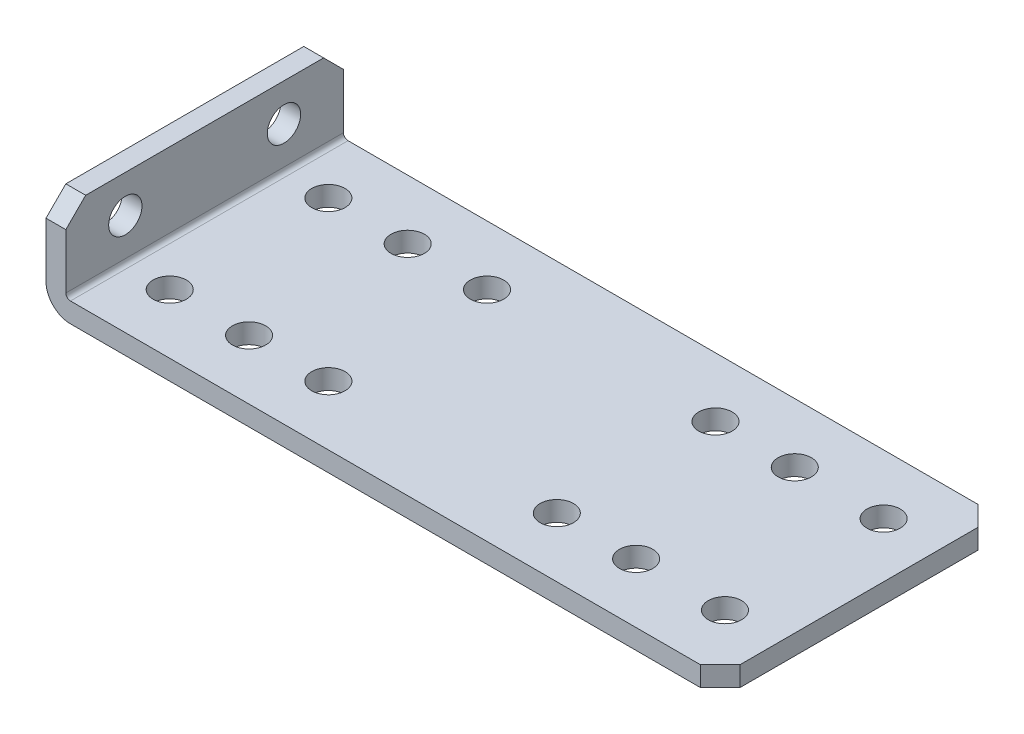
ISO-10303-21;
HEADER;
FILE_DESCRIPTION(('STEP AP214'),'2;1');
FILE_NAME('part.step','',(''),(''),'','','');
FILE_SCHEMA(('AUTOMOTIVE_DESIGN { 1 0 10303 214 1 1 1 1 }'));
ENDSEC;
DATA;
#1=APPLICATION_CONTEXT('core data for automotive mechanical design processes');
#2=APPLICATION_PROTOCOL_DEFINITION('international standard','automotive_design',2000,#1);
#3=PRODUCT_CONTEXT('',#1,'mechanical');
#4=PRODUCT('Part','Part','',(#3));
#5=PRODUCT_RELATED_PRODUCT_CATEGORY('part','',(#4));
#6=PRODUCT_DEFINITION_FORMATION('','',#4);
#7=PRODUCT_DEFINITION_CONTEXT('part definition',#1,'design');
#8=PRODUCT_DEFINITION('design','',#6,#7);
#9=PRODUCT_DEFINITION_SHAPE('','',#8);
#10=(LENGTH_UNIT() NAMED_UNIT(*) SI_UNIT(.MILLI.,.METRE.));
#11=(NAMED_UNIT(*) PLANE_ANGLE_UNIT() SI_UNIT($,.RADIAN.));
#12=(NAMED_UNIT(*) SI_UNIT($,.STERADIAN.) SOLID_ANGLE_UNIT());
#13=UNCERTAINTY_MEASURE_WITH_UNIT(LENGTH_MEASURE(1.E-05),#10,'distance_accuracy_value','');
#14=(GEOMETRIC_REPRESENTATION_CONTEXT(3) GLOBAL_UNCERTAINTY_ASSIGNED_CONTEXT((#13)) GLOBAL_UNIT_ASSIGNED_CONTEXT((#10,
#11,#12)) REPRESENTATION_CONTEXT('',''));
#15=CARTESIAN_POINT('',(0.,0.,0.));
#16=DIRECTION('',(0.,0.,1.));
#17=DIRECTION('',(1.,0.,0.));
#18=AXIS2_PLACEMENT_3D('',#15,#16,#17);
#19=CARTESIAN_POINT('',(0.,0.,44.45));
#20=DIRECTION('',(-1.,0.,0.));
#21=DIRECTION('',(0.,0.,1.));
#22=AXIS2_PLACEMENT_3D('',#19,#20,#21);
#23=PLANE('',#22);
#24=DIRECTION('',(0.,1.,0.));
#25=VECTOR('',#24,1.);
#26=CARTESIAN_POINT('',(0.,3.9116,0.));
#27=LINE('',#26,#25);
#28=CARTESIAN_POINT('',(0.,12.7,0.));
#29=VERTEX_POINT('',#28);
#30=CARTESIAN_POINT('',(0.,3.9116,0.));
#31=VERTEX_POINT('',#30);
#32=EDGE_CURVE('E120',#29,#31,#27,.F.);
#33=ORIENTED_EDGE('',*,*,#32,.T.);
#34=DIRECTION('',(0.,0.,-1.));
#35=VECTOR('',#34,1.);
#36=CARTESIAN_POINT('',(0.,3.9116,44.45));
#37=LINE('',#36,#35);
#38=CARTESIAN_POINT('',(0.,3.9116,44.45));
#39=VERTEX_POINT('',#38);
#40=EDGE_CURVE('E117',#39,#31,#37,.T.);
#41=ORIENTED_EDGE('',*,*,#40,.F.);
#42=DIRECTION('',(0.,1.,0.));
#43=VECTOR('',#42,1.);
#44=CARTESIAN_POINT('',(0.,3.175,44.45));
#45=LINE('',#44,#43);
#46=CARTESIAN_POINT('',(0.,12.7,44.45));
#47=VERTEX_POINT('',#46);
#48=EDGE_CURVE('E102',#47,#39,#45,.F.);
#49=ORIENTED_EDGE('',*,*,#48,.F.);
#50=DIRECTION('',(0.,0.707106781186549,-0.707106781186546));
#51=VECTOR('',#50,1.);
#52=CARTESIAN_POINT('',(0.,15.875,41.275));
#53=LINE('',#52,#51);
#54=CARTESIAN_POINT('',(0.,15.875,41.275));
#55=VERTEX_POINT('',#54);
#56=EDGE_CURVE('E293',#47,#55,#53,.T.);
#57=ORIENTED_EDGE('',*,*,#56,.T.);
#58=DIRECTION('',(0.,0.,1.));
#59=VECTOR('',#58,1.);
#60=CARTESIAN_POINT('',(0.,15.875,44.45));
#61=LINE('',#60,#59);
#62=CARTESIAN_POINT('',(0.,15.875,3.17500000000002));
#63=VERTEX_POINT('',#62);
#64=EDGE_CURVE('E291',#63,#55,#61,.T.);
#65=ORIENTED_EDGE('',*,*,#64,.F.);
#66=DIRECTION('',(0.,0.707106781186546,0.707106781186549));
#67=VECTOR('',#66,1.);
#68=CARTESIAN_POINT('',(0.,12.7,0.));
#69=LINE('',#68,#67);
#70=EDGE_CURVE('E114',#29,#63,#69,.T.);
#71=ORIENTED_EDGE('',*,*,#70,.F.);
#72=EDGE_LOOP('',(#33,#41,#49,#57,#65,#71));
#73=FACE_BOUND('',#72,.T.);
#74=CARTESIAN_POINT('',(0.,9.89330000000001,34.925));
#75=DIRECTION('',(-1.,0.,0.));
#76=DIRECTION('',(0.,0.,1.));
#77=AXIS2_PLACEMENT_3D('',#74,#75,#76);
#78=CIRCLE('',#77,2.667);
#79=CARTESIAN_POINT('',(0.,9.89330000000001,37.592));
#80=VERTEX_POINT('',#79);
#81=EDGE_CURVE('E133',#80,#80,#78,.F.);
#82=ORIENTED_EDGE('',*,*,#81,.T.);
#83=EDGE_LOOP('',(#82));
#84=FACE_BOUND('',#83,.T.);
#85=CARTESIAN_POINT('',(0.,9.8933,9.525));
#86=DIRECTION('',(-1.,0.,0.));
#87=DIRECTION('',(0.,0.,1.));
#88=AXIS2_PLACEMENT_3D('',#85,#86,#87);
#89=CIRCLE('',#88,2.667);
#90=CARTESIAN_POINT('',(0.,9.8933,12.192));
#91=VERTEX_POINT('',#90);
#92=EDGE_CURVE('E20',#91,#91,#89,.F.);
#93=ORIENTED_EDGE('',*,*,#92,.T.);
#94=EDGE_LOOP('',(#93));
#95=FACE_BOUND('',#94,.T.);
#96=ADVANCED_FACE('F17',(#73,#84,#95),#23,.T.);
#97=CARTESIAN_POINT('',(107.95,9.8933,9.525));
#98=DIRECTION('',(-1.,0.,0.));
#99=DIRECTION('',(0.,0.,1.));
#100=AXIS2_PLACEMENT_3D('',#97,#98,#99);
#101=CYLINDRICAL_SURFACE('',#100,2.667);
#102=CARTESIAN_POINT('',(3.175,9.8933,9.525));
#103=DIRECTION('',(-1.,0.,0.));
#104=DIRECTION('',(0.,0.,1.));
#105=AXIS2_PLACEMENT_3D('',#102,#103,#104);
#106=CIRCLE('',#105,2.667);
#107=CARTESIAN_POINT('',(3.175,9.8933,12.192));
#108=VERTEX_POINT('',#107);
#109=EDGE_CURVE('E130',#108,#108,#106,.F.);
#110=ORIENTED_EDGE('',*,*,#109,.T.);
#111=EDGE_LOOP('',(#110));
#112=FACE_BOUND('',#111,.T.);
#113=ORIENTED_EDGE('',*,*,#92,.F.);
#114=EDGE_LOOP('',(#113));
#115=FACE_BOUND('',#114,.T.);
#116=ADVANCED_FACE('F141',(#112,#115),#101,.F.);
#117=CARTESIAN_POINT('',(107.95,9.89330000000001,34.925));
#118=DIRECTION('',(-1.,0.,0.));
#119=DIRECTION('',(0.,0.,1.));
#120=AXIS2_PLACEMENT_3D('',#117,#118,#119);
#121=CYLINDRICAL_SURFACE('',#120,2.667);
#122=CARTESIAN_POINT('',(3.175,9.89330000000001,34.925));
#123=DIRECTION('',(-1.,0.,0.));
#124=DIRECTION('',(0.,0.,1.));
#125=AXIS2_PLACEMENT_3D('',#122,#123,#124);
#126=CIRCLE('',#125,2.667);
#127=CARTESIAN_POINT('',(3.175,9.89330000000001,37.592));
#128=VERTEX_POINT('',#127);
#129=EDGE_CURVE('E265',#128,#128,#126,.F.);
#130=ORIENTED_EDGE('',*,*,#129,.T.);
#131=EDGE_LOOP('',(#130));
#132=FACE_BOUND('',#131,.T.);
#133=ORIENTED_EDGE('',*,*,#81,.F.);
#134=EDGE_LOOP('',(#133));
#135=FACE_BOUND('',#134,.T.);
#136=ADVANCED_FACE('F143',(#132,#135),#121,.F.);
#137=CARTESIAN_POINT('',(3.9116,12.7,0.));
#138=DIRECTION('',(0.,0.707106781186549,-0.707106781186546));
#139=DIRECTION('',(0.,0.707106781186546,0.707106781186549));
#140=AXIS2_PLACEMENT_3D('',#137,#138,#139);
#141=PLANE('',#140);
#142=DIRECTION('',(0.,-0.707106781186546,-0.707106781186549));
#143=VECTOR('',#142,1.);
#144=CARTESIAN_POINT('',(3.175,15.875,3.17500000000001));
#145=LINE('',#144,#143);
#146=CARTESIAN_POINT('',(3.175,15.875,3.17500000000001));
#147=VERTEX_POINT('',#146);
#148=CARTESIAN_POINT('',(3.175,12.7,0.));
#149=VERTEX_POINT('',#148);
#150=EDGE_CURVE('E257',#147,#149,#145,.T.);
#151=ORIENTED_EDGE('',*,*,#150,.T.);
#152=DIRECTION('',(1.,0.,0.));
#153=VECTOR('',#152,1.);
#154=CARTESIAN_POINT('',(3.9116,12.7,0.));
#155=LINE('',#154,#153);
#156=EDGE_CURVE('E258',#149,#29,#155,.F.);
#157=ORIENTED_EDGE('',*,*,#156,.T.);
#158=ORIENTED_EDGE('',*,*,#70,.T.);
#159=DIRECTION('',(1.,0.,0.));
#160=VECTOR('',#159,1.);
#161=CARTESIAN_POINT('',(0.,15.875,3.17500000000001));
#162=LINE('',#161,#160);
#163=EDGE_CURVE('E260',#147,#63,#162,.F.);
#164=ORIENTED_EDGE('',*,*,#163,.F.);
#165=EDGE_LOOP('',(#151,#157,#158,#164));
#166=FACE_BOUND('',#165,.T.);
#167=ADVANCED_FACE('F150',(#166),#141,.T.);
#168=CARTESIAN_POINT('',(0.,15.875,41.275));
#169=DIRECTION('',(0.,-0.707106781186546,-0.707106781186549));
#170=DIRECTION('',(0.,0.707106781186549,-0.707106781186546));
#171=AXIS2_PLACEMENT_3D('',#168,#169,#170);
#172=PLANE('',#171);
#173=DIRECTION('',(1.,0.,0.));
#174=VECTOR('',#173,1.);
#175=CARTESIAN_POINT('',(0.,12.7,44.45));
#176=LINE('',#175,#174);
#177=CARTESIAN_POINT('',(3.175,12.7,44.45));
#178=VERTEX_POINT('',#177);
#179=EDGE_CURVE('E110',#178,#47,#176,.F.);
#180=ORIENTED_EDGE('',*,*,#179,.F.);
#181=DIRECTION('',(0.,0.707106781186549,-0.707106781186546));
#182=VECTOR('',#181,1.);
#183=CARTESIAN_POINT('',(3.175,12.7,44.45));
#184=LINE('',#183,#182);
#185=CARTESIAN_POINT('',(3.175,15.875,41.275));
#186=VERTEX_POINT('',#185);
#187=EDGE_CURVE('E284',#178,#186,#184,.T.);
#188=ORIENTED_EDGE('',*,*,#187,.T.);
#189=DIRECTION('',(1.,0.,0.));
#190=VECTOR('',#189,1.);
#191=CARTESIAN_POINT('',(0.,15.875,41.275));
#192=LINE('',#191,#190);
#193=EDGE_CURVE('E278',#55,#186,#192,.T.);
#194=ORIENTED_EDGE('',*,*,#193,.F.);
#195=ORIENTED_EDGE('',*,*,#56,.F.);
#196=EDGE_LOOP('',(#180,#188,#194,#195));
#197=FACE_BOUND('',#196,.T.);
#198=ADVANCED_FACE('F245',(#197),#172,.F.);
#199=CARTESIAN_POINT('',(0.,15.875,44.45));
#200=DIRECTION('',(0.,1.,0.));
#201=DIRECTION('',(0.,0.,1.));
#202=AXIS2_PLACEMENT_3D('',#199,#200,#201);
#203=PLANE('',#202);
#204=DIRECTION('',(0.,0.,1.));
#205=VECTOR('',#204,1.);
#206=CARTESIAN_POINT('',(3.175,15.875,44.45));
#207=LINE('',#206,#205);
#208=EDGE_CURVE('E281',#186,#147,#207,.F.);
#209=ORIENTED_EDGE('',*,*,#208,.T.);
#210=ORIENTED_EDGE('',*,*,#163,.T.);
#211=ORIENTED_EDGE('',*,*,#64,.T.);
#212=ORIENTED_EDGE('',*,*,#193,.T.);
#213=EDGE_LOOP('',(#209,#210,#211,#212));
#214=FACE_BOUND('',#213,.T.);
#215=ADVANCED_FACE('F242',(#214),#203,.T.);
#216=CARTESIAN_POINT('',(3.9116,3.9116,44.45));
#217=DIRECTION('',(0.,0.,-1.));
#218=DIRECTION('',(-1.,0.,0.));
#219=AXIS2_PLACEMENT_3D('',#216,#217,#218);
#220=CYLINDRICAL_SURFACE('',#219,3.9116);
#221=CARTESIAN_POINT('',(3.9116,3.9116,44.45));
#222=DIRECTION('',(0.,0.,-1.));
#223=DIRECTION('',(-1.,0.,0.));
#224=AXIS2_PLACEMENT_3D('',#221,#222,#223);
#225=CIRCLE('',#224,3.9116);
#226=CARTESIAN_POINT('',(3.9116,0.,44.45));
#227=VERTEX_POINT('',#226);
#228=EDGE_CURVE('E107',#39,#227,#225,.F.);
#229=ORIENTED_EDGE('',*,*,#228,.F.);
#230=ORIENTED_EDGE('',*,*,#40,.T.);
#231=CARTESIAN_POINT('',(3.9116,3.9116,0.));
#232=DIRECTION('',(0.,0.,-1.));
#233=DIRECTION('',(-1.,0.,0.));
#234=AXIS2_PLACEMENT_3D('',#231,#232,#233);
#235=CIRCLE('',#234,3.9116);
#236=CARTESIAN_POINT('',(3.9116,0.,0.));
#237=VERTEX_POINT('',#236);
#238=EDGE_CURVE('E283',#237,#31,#235,.T.);
#239=ORIENTED_EDGE('',*,*,#238,.F.);
#240=DIRECTION('',(0.,0.,-1.));
#241=VECTOR('',#240,1.);
#242=CARTESIAN_POINT('',(3.9116,0.,44.45));
#243=LINE('',#242,#241);
#244=EDGE_CURVE('E126',#227,#237,#243,.T.);
#245=ORIENTED_EDGE('',*,*,#244,.F.);
#246=EDGE_LOOP('',(#229,#230,#239,#245));
#247=FACE_BOUND('',#246,.T.);
#248=ADVANCED_FACE('F125',(#247),#220,.T.);
#249=CARTESIAN_POINT('',(3.175,0.,44.45));
#250=DIRECTION('',(-1.,0.,0.));
#251=DIRECTION('',(0.,0.,1.));
#252=AXIS2_PLACEMENT_3D('',#249,#250,#251);
#253=PLANE('',#252);
#254=ORIENTED_EDGE('',*,*,#187,.F.);
#255=DIRECTION('',(0.,1.,0.));
#256=VECTOR('',#255,1.);
#257=CARTESIAN_POINT('',(3.175,0.,44.45));
#258=LINE('',#257,#256);
#259=CARTESIAN_POINT('',(3.175,3.9116,44.45));
#260=VERTEX_POINT('',#259);
#261=EDGE_CURVE('E267',#260,#178,#258,.T.);
#262=ORIENTED_EDGE('',*,*,#261,.F.);
#263=DIRECTION('',(0.,0.,-1.));
#264=VECTOR('',#263,1.);
#265=CARTESIAN_POINT('',(3.175,3.9116,44.45));
#266=LINE('',#265,#264);
#267=CARTESIAN_POINT('',(3.175,3.9116,0.));
#268=VERTEX_POINT('',#267);
#269=EDGE_CURVE('E343',#260,#268,#266,.T.);
#270=ORIENTED_EDGE('',*,*,#269,.T.);
#271=DIRECTION('',(0.,1.,0.));
#272=VECTOR('',#271,1.);
#273=CARTESIAN_POINT('',(3.175,0.,0.));
#274=LINE('',#273,#272);
#275=EDGE_CURVE('E264',#149,#268,#274,.F.);
#276=ORIENTED_EDGE('',*,*,#275,.F.);
#277=ORIENTED_EDGE('',*,*,#150,.F.);
#278=ORIENTED_EDGE('',*,*,#208,.F.);
#279=EDGE_LOOP('',(#254,#262,#270,#276,#277,#278));
#280=FACE_BOUND('',#279,.T.);
#281=ORIENTED_EDGE('',*,*,#129,.F.);
#282=EDGE_LOOP('',(#281));
#283=FACE_BOUND('',#282,.T.);
#284=ORIENTED_EDGE('',*,*,#109,.F.);
#285=EDGE_LOOP('',(#284));
#286=FACE_BOUND('',#285,.T.);
#287=ADVANCED_FACE('F235',(#280,#283,#286),#253,.F.);
#288=CARTESIAN_POINT('',(0.,0.,44.45));
#289=DIRECTION('',(0.,-1.,0.));
#290=DIRECTION('',(0.,0.,-1.));
#291=AXIS2_PLACEMENT_3D('',#288,#289,#290);
#292=PLANE('',#291);
#293=DIRECTION('',(1.,0.,0.));
#294=VECTOR('',#293,1.);
#295=CARTESIAN_POINT('',(3.9116,0.,44.45));
#296=LINE('',#295,#294);
#297=CARTESIAN_POINT('',(104.775,0.,44.45));
#298=VERTEX_POINT('',#297);
#299=EDGE_CURVE('E410',#227,#298,#296,.T.);
#300=ORIENTED_EDGE('',*,*,#299,.F.);
#301=ORIENTED_EDGE('',*,*,#244,.T.);
#302=DIRECTION('',(-1.,0.,0.));
#303=VECTOR('',#302,1.);
#304=CARTESIAN_POINT('',(3.175,0.,0.));
#305=LINE('',#304,#303);
#306=CARTESIAN_POINT('',(104.775,0.,0.));
#307=VERTEX_POINT('',#306);
#308=EDGE_CURVE('E342',#307,#237,#305,.T.);
#309=ORIENTED_EDGE('',*,*,#308,.F.);
#310=DIRECTION('',(0.707106781186546,0.,0.707106781186549));
#311=VECTOR('',#310,1.);
#312=CARTESIAN_POINT('',(104.775,0.,0.));
#313=LINE('',#312,#311);
#314=CARTESIAN_POINT('',(107.95,0.,3.17500000000001));
#315=VERTEX_POINT('',#314);
#316=EDGE_CURVE('E389',#307,#315,#313,.T.);
#317=ORIENTED_EDGE('',*,*,#316,.T.);
#318=DIRECTION('',(0.,0.,-1.));
#319=VECTOR('',#318,1.);
#320=CARTESIAN_POINT('',(107.95,0.,44.45));
#321=LINE('',#320,#319);
#322=CARTESIAN_POINT('',(107.95,0.,41.275));
#323=VERTEX_POINT('',#322);
#324=EDGE_CURVE('E392',#323,#315,#321,.T.);
#325=ORIENTED_EDGE('',*,*,#324,.F.);
#326=DIRECTION('',(-0.707106781186549,0.,0.707106781186546));
#327=VECTOR('',#326,1.);
#328=CARTESIAN_POINT('',(107.95,0.,41.275));
#329=LINE('',#328,#327);
#330=EDGE_CURVE('E347',#323,#298,#329,.T.);
#331=ORIENTED_EDGE('',*,*,#330,.T.);
#332=EDGE_LOOP('',(#300,#301,#309,#317,#325,#331));
#333=FACE_BOUND('',#332,.T.);
#334=CARTESIAN_POINT('',(99.187,0.,9.52499999999999));
#335=DIRECTION('',(0.,1.,0.));
#336=DIRECTION('',(0.,0.,1.));
#337=AXIS2_PLACEMENT_3D('',#334,#335,#336);
#338=CIRCLE('',#337,2.667);
#339=CARTESIAN_POINT('',(99.187,0.,12.192));
#340=VERTEX_POINT('',#339);
#341=EDGE_CURVE('E344',#340,#340,#338,.T.);
#342=ORIENTED_EDGE('',*,*,#341,.T.);
#343=EDGE_LOOP('',(#342));
#344=FACE_BOUND('',#343,.T.);
#345=CARTESIAN_POINT('',(99.187,0.,34.925));
#346=DIRECTION('',(0.,1.,0.));
#347=DIRECTION('',(0.,0.,1.));
#348=AXIS2_PLACEMENT_3D('',#345,#346,#347);
#349=CIRCLE('',#348,2.667);
#350=CARTESIAN_POINT('',(99.187,0.,37.592));
#351=VERTEX_POINT('',#350);
#352=EDGE_CURVE('E348',#351,#351,#349,.T.);
#353=ORIENTED_EDGE('',*,*,#352,.T.);
#354=EDGE_LOOP('',(#353));
#355=FACE_BOUND('',#354,.T.);
#356=CARTESIAN_POINT('',(22.987,0.,9.525));
#357=DIRECTION('',(0.,1.,0.));
#358=DIRECTION('',(0.,0.,1.));
#359=AXIS2_PLACEMENT_3D('',#356,#357,#358);
#360=CIRCLE('',#359,2.667);
#361=CARTESIAN_POINT('',(22.987,0.,12.192));
#362=VERTEX_POINT('',#361);
#363=EDGE_CURVE('E351',#362,#362,#360,.T.);
#364=ORIENTED_EDGE('',*,*,#363,.T.);
#365=EDGE_LOOP('',(#364));
#366=FACE_BOUND('',#365,.T.);
#367=CARTESIAN_POINT('',(10.287,0.,9.525));
#368=DIRECTION('',(0.,1.,0.));
#369=DIRECTION('',(0.,0.,1.));
#370=AXIS2_PLACEMENT_3D('',#367,#368,#369);
#371=CIRCLE('',#370,2.667);
#372=CARTESIAN_POINT('',(10.287,0.,12.192));
#373=VERTEX_POINT('',#372);
#374=EDGE_CURVE('E354',#373,#373,#371,.T.);
#375=ORIENTED_EDGE('',*,*,#374,.T.);
#376=EDGE_LOOP('',(#375));
#377=FACE_BOUND('',#376,.T.);
#378=CARTESIAN_POINT('',(10.287,0.,34.925));
#379=DIRECTION('',(0.,1.,0.));
#380=DIRECTION('',(0.,0.,1.));
#381=AXIS2_PLACEMENT_3D('',#378,#379,#380);
#382=CIRCLE('',#381,2.667);
#383=CARTESIAN_POINT('',(10.287,0.,37.592));
#384=VERTEX_POINT('',#383);
#385=EDGE_CURVE('E357',#384,#384,#382,.T.);
#386=ORIENTED_EDGE('',*,*,#385,.T.);
#387=EDGE_LOOP('',(#386));
#388=FACE_BOUND('',#387,.T.);
#389=CARTESIAN_POINT('',(35.687,0.,9.52499999999999));
#390=DIRECTION('',(0.,1.,0.));
#391=DIRECTION('',(0.,0.,1.));
#392=AXIS2_PLACEMENT_3D('',#389,#390,#391);
#393=CIRCLE('',#392,2.667);
#394=CARTESIAN_POINT('',(35.687,0.,12.192));
#395=VERTEX_POINT('',#394);
#396=EDGE_CURVE('E360',#395,#395,#393,.T.);
#397=ORIENTED_EDGE('',*,*,#396,.T.);
#398=EDGE_LOOP('',(#397));
#399=FACE_BOUND('',#398,.T.);
#400=CARTESIAN_POINT('',(35.687,0.,34.925));
#401=DIRECTION('',(0.,1.,0.));
#402=DIRECTION('',(0.,0.,1.));
#403=AXIS2_PLACEMENT_3D('',#400,#401,#402);
#404=CIRCLE('',#403,2.667);
#405=CARTESIAN_POINT('',(35.687,0.,37.592));
#406=VERTEX_POINT('',#405);
#407=EDGE_CURVE('E363',#406,#406,#404,.T.);
#408=ORIENTED_EDGE('',*,*,#407,.T.);
#409=EDGE_LOOP('',(#408));
#410=FACE_BOUND('',#409,.T.);
#411=CARTESIAN_POINT('',(22.987,0.,34.925));
#412=DIRECTION('',(0.,1.,0.));
#413=DIRECTION('',(0.,0.,1.));
#414=AXIS2_PLACEMENT_3D('',#411,#412,#413);
#415=CIRCLE('',#414,2.667);
#416=CARTESIAN_POINT('',(22.987,0.,37.592));
#417=VERTEX_POINT('',#416);
#418=EDGE_CURVE('E366',#417,#417,#415,.T.);
#419=ORIENTED_EDGE('',*,*,#418,.T.);
#420=EDGE_LOOP('',(#419));
#421=FACE_BOUND('',#420,.T.);
#422=CARTESIAN_POINT('',(72.263,0.,9.52499999999999));
#423=DIRECTION('',(0.,1.,0.));
#424=DIRECTION('',(0.,0.,1.));
#425=AXIS2_PLACEMENT_3D('',#422,#423,#424);
#426=CIRCLE('',#425,2.667);
#427=CARTESIAN_POINT('',(72.263,0.,12.192));
#428=VERTEX_POINT('',#427);
#429=EDGE_CURVE('E369',#428,#428,#426,.T.);
#430=ORIENTED_EDGE('',*,*,#429,.T.);
#431=EDGE_LOOP('',(#430));
#432=FACE_BOUND('',#431,.T.);
#433=CARTESIAN_POINT('',(72.263,0.,34.925));
#434=DIRECTION('',(0.,1.,0.));
#435=DIRECTION('',(0.,0.,1.));
#436=AXIS2_PLACEMENT_3D('',#433,#434,#435);
#437=CIRCLE('',#436,2.667);
#438=CARTESIAN_POINT('',(72.263,0.,37.592));
#439=VERTEX_POINT('',#438);
#440=EDGE_CURVE('E372',#439,#439,#437,.T.);
#441=ORIENTED_EDGE('',*,*,#440,.T.);
#442=EDGE_LOOP('',(#441));
#443=FACE_BOUND('',#442,.T.);
#444=CARTESIAN_POINT('',(84.963,0.,34.925));
#445=DIRECTION('',(0.,1.,0.));
#446=DIRECTION('',(0.,0.,1.));
#447=AXIS2_PLACEMENT_3D('',#444,#445,#446);
#448=CIRCLE('',#447,2.66700000000001);
#449=CARTESIAN_POINT('',(84.963,0.,37.592));
#450=VERTEX_POINT('',#449);
#451=EDGE_CURVE('E375',#450,#450,#448,.T.);
#452=ORIENTED_EDGE('',*,*,#451,.T.);
#453=EDGE_LOOP('',(#452));
#454=FACE_BOUND('',#453,.T.);
#455=CARTESIAN_POINT('',(84.963,0.,9.525));
#456=DIRECTION('',(0.,1.,0.));
#457=DIRECTION('',(0.,0.,1.));
#458=AXIS2_PLACEMENT_3D('',#455,#456,#457);
#459=CIRCLE('',#458,2.66700000000001);
#460=CARTESIAN_POINT('',(84.963,0.,12.192));
#461=VERTEX_POINT('',#460);
#462=EDGE_CURVE('E378',#461,#461,#459,.T.);
#463=ORIENTED_EDGE('',*,*,#462,.T.);
#464=EDGE_LOOP('',(#463));
#465=FACE_BOUND('',#464,.T.);
#466=ADVANCED_FACE('F231',(#333,#344,#355,#366,#377,#388,#399,#410,#421,#432,#443,#454,#465),
#292,.T.);
#467=CARTESIAN_POINT('',(84.963,0.,9.525));
#468=DIRECTION('',(0.,1.,0.));
#469=DIRECTION('',(0.,0.,1.));
#470=AXIS2_PLACEMENT_3D('',#467,#468,#469);
#471=CYLINDRICAL_SURFACE('',#470,2.66700000000001);
#472=ORIENTED_EDGE('',*,*,#462,.F.);
#473=EDGE_LOOP('',(#472));
#474=FACE_BOUND('',#473,.T.);
#475=CARTESIAN_POINT('',(84.963,3.175,9.525));
#476=DIRECTION('',(0.,1.,0.));
#477=DIRECTION('',(0.,0.,1.));
#478=AXIS2_PLACEMENT_3D('',#475,#476,#477);
#479=CIRCLE('',#478,2.66700000000001);
#480=CARTESIAN_POINT('',(84.963,3.175,12.192));
#481=VERTEX_POINT('',#480);
#482=EDGE_CURVE('E336',#481,#481,#479,.T.);
#483=ORIENTED_EDGE('',*,*,#482,.T.);
#484=EDGE_LOOP('',(#483));
#485=FACE_BOUND('',#484,.T.);
#486=ADVANCED_FACE('F227',(#474,#485),#471,.F.);
#487=CARTESIAN_POINT('',(84.963,0.,34.925));
#488=DIRECTION('',(0.,1.,0.));
#489=DIRECTION('',(0.,0.,1.));
#490=AXIS2_PLACEMENT_3D('',#487,#488,#489);
#491=CYLINDRICAL_SURFACE('',#490,2.66700000000001);
#492=ORIENTED_EDGE('',*,*,#451,.F.);
#493=EDGE_LOOP('',(#492));
#494=FACE_BOUND('',#493,.T.);
#495=CARTESIAN_POINT('',(84.963,3.175,34.925));
#496=DIRECTION('',(0.,1.,0.));
#497=DIRECTION('',(0.,0.,1.));
#498=AXIS2_PLACEMENT_3D('',#495,#496,#497);
#499=CIRCLE('',#498,2.66700000000001);
#500=CARTESIAN_POINT('',(84.963,3.175,37.592));
#501=VERTEX_POINT('',#500);
#502=EDGE_CURVE('E333',#501,#501,#499,.T.);
#503=ORIENTED_EDGE('',*,*,#502,.T.);
#504=EDGE_LOOP('',(#503));
#505=FACE_BOUND('',#504,.T.);
#506=ADVANCED_FACE('F223',(#494,#505),#491,.F.);
#507=CARTESIAN_POINT('',(72.263,0.,34.925));
#508=DIRECTION('',(0.,1.,0.));
#509=DIRECTION('',(0.,0.,1.));
#510=AXIS2_PLACEMENT_3D('',#507,#508,#509);
#511=CYLINDRICAL_SURFACE('',#510,2.667);
#512=ORIENTED_EDGE('',*,*,#440,.F.);
#513=EDGE_LOOP('',(#512));
#514=FACE_BOUND('',#513,.T.);
#515=CARTESIAN_POINT('',(72.263,3.175,34.925));
#516=DIRECTION('',(0.,1.,0.));
#517=DIRECTION('',(0.,0.,1.));
#518=AXIS2_PLACEMENT_3D('',#515,#516,#517);
#519=CIRCLE('',#518,2.667);
#520=CARTESIAN_POINT('',(72.263,3.175,37.592));
#521=VERTEX_POINT('',#520);
#522=EDGE_CURVE('E330',#521,#521,#519,.T.);
#523=ORIENTED_EDGE('',*,*,#522,.T.);
#524=EDGE_LOOP('',(#523));
#525=FACE_BOUND('',#524,.T.);
#526=ADVANCED_FACE('F219',(#514,#525),#511,.F.);
#527=CARTESIAN_POINT('',(72.263,0.,9.52499999999999));
#528=DIRECTION('',(0.,1.,0.));
#529=DIRECTION('',(0.,0.,1.));
#530=AXIS2_PLACEMENT_3D('',#527,#528,#529);
#531=CYLINDRICAL_SURFACE('',#530,2.667);
#532=ORIENTED_EDGE('',*,*,#429,.F.);
#533=EDGE_LOOP('',(#532));
#534=FACE_BOUND('',#533,.T.);
#535=CARTESIAN_POINT('',(72.263,3.175,9.52499999999999));
#536=DIRECTION('',(0.,1.,0.));
#537=DIRECTION('',(0.,0.,1.));
#538=AXIS2_PLACEMENT_3D('',#535,#536,#537);
#539=CIRCLE('',#538,2.667);
#540=CARTESIAN_POINT('',(72.263,3.175,12.192));
#541=VERTEX_POINT('',#540);
#542=EDGE_CURVE('E327',#541,#541,#539,.T.);
#543=ORIENTED_EDGE('',*,*,#542,.T.);
#544=EDGE_LOOP('',(#543));
#545=FACE_BOUND('',#544,.T.);
#546=ADVANCED_FACE('F215',(#534,#545),#531,.F.);
#547=CARTESIAN_POINT('',(22.987,0.,34.925));
#548=DIRECTION('',(0.,1.,0.));
#549=DIRECTION('',(0.,0.,1.));
#550=AXIS2_PLACEMENT_3D('',#547,#548,#549);
#551=CYLINDRICAL_SURFACE('',#550,2.667);
#552=ORIENTED_EDGE('',*,*,#418,.F.);
#553=EDGE_LOOP('',(#552));
#554=FACE_BOUND('',#553,.T.);
#555=CARTESIAN_POINT('',(22.987,3.175,34.925));
#556=DIRECTION('',(0.,1.,0.));
#557=DIRECTION('',(0.,0.,1.));
#558=AXIS2_PLACEMENT_3D('',#555,#556,#557);
#559=CIRCLE('',#558,2.667);
#560=CARTESIAN_POINT('',(22.987,3.175,37.592));
#561=VERTEX_POINT('',#560);
#562=EDGE_CURVE('E324',#561,#561,#559,.T.);
#563=ORIENTED_EDGE('',*,*,#562,.T.);
#564=EDGE_LOOP('',(#563));
#565=FACE_BOUND('',#564,.T.);
#566=ADVANCED_FACE('F211',(#554,#565),#551,.F.);
#567=CARTESIAN_POINT('',(35.687,0.,34.925));
#568=DIRECTION('',(0.,1.,0.));
#569=DIRECTION('',(0.,0.,1.));
#570=AXIS2_PLACEMENT_3D('',#567,#568,#569);
#571=CYLINDRICAL_SURFACE('',#570,2.667);
#572=ORIENTED_EDGE('',*,*,#407,.F.);
#573=EDGE_LOOP('',(#572));
#574=FACE_BOUND('',#573,.T.);
#575=CARTESIAN_POINT('',(35.687,3.175,34.925));
#576=DIRECTION('',(0.,1.,0.));
#577=DIRECTION('',(0.,0.,1.));
#578=AXIS2_PLACEMENT_3D('',#575,#576,#577);
#579=CIRCLE('',#578,2.667);
#580=CARTESIAN_POINT('',(35.687,3.175,37.592));
#581=VERTEX_POINT('',#580);
#582=EDGE_CURVE('E321',#581,#581,#579,.T.);
#583=ORIENTED_EDGE('',*,*,#582,.T.);
#584=EDGE_LOOP('',(#583));
#585=FACE_BOUND('',#584,.T.);
#586=ADVANCED_FACE('F207',(#574,#585),#571,.F.);
#587=CARTESIAN_POINT('',(35.687,0.,9.52499999999999));
#588=DIRECTION('',(0.,1.,0.));
#589=DIRECTION('',(0.,0.,1.));
#590=AXIS2_PLACEMENT_3D('',#587,#588,#589);
#591=CYLINDRICAL_SURFACE('',#590,2.667);
#592=ORIENTED_EDGE('',*,*,#396,.F.);
#593=EDGE_LOOP('',(#592));
#594=FACE_BOUND('',#593,.T.);
#595=CARTESIAN_POINT('',(35.687,3.175,9.52499999999999));
#596=DIRECTION('',(0.,1.,0.));
#597=DIRECTION('',(0.,0.,1.));
#598=AXIS2_PLACEMENT_3D('',#595,#596,#597);
#599=CIRCLE('',#598,2.667);
#600=CARTESIAN_POINT('',(35.687,3.175,12.192));
#601=VERTEX_POINT('',#600);
#602=EDGE_CURVE('E318',#601,#601,#599,.T.);
#603=ORIENTED_EDGE('',*,*,#602,.T.);
#604=EDGE_LOOP('',(#603));
#605=FACE_BOUND('',#604,.T.);
#606=ADVANCED_FACE('F203',(#594,#605),#591,.F.);
#607=CARTESIAN_POINT('',(10.287,0.,34.925));
#608=DIRECTION('',(0.,1.,0.));
#609=DIRECTION('',(0.,0.,1.));
#610=AXIS2_PLACEMENT_3D('',#607,#608,#609);
#611=CYLINDRICAL_SURFACE('',#610,2.667);
#612=ORIENTED_EDGE('',*,*,#385,.F.);
#613=EDGE_LOOP('',(#612));
#614=FACE_BOUND('',#613,.T.);
#615=CARTESIAN_POINT('',(10.287,3.175,34.925));
#616=DIRECTION('',(0.,1.,0.));
#617=DIRECTION('',(0.,0.,1.));
#618=AXIS2_PLACEMENT_3D('',#615,#616,#617);
#619=CIRCLE('',#618,2.667);
#620=CARTESIAN_POINT('',(10.287,3.175,37.592));
#621=VERTEX_POINT('',#620);
#622=EDGE_CURVE('E315',#621,#621,#619,.T.);
#623=ORIENTED_EDGE('',*,*,#622,.T.);
#624=EDGE_LOOP('',(#623));
#625=FACE_BOUND('',#624,.T.);
#626=ADVANCED_FACE('F199',(#614,#625),#611,.F.);
#627=CARTESIAN_POINT('',(10.287,0.,9.525));
#628=DIRECTION('',(0.,1.,0.));
#629=DIRECTION('',(0.,0.,1.));
#630=AXIS2_PLACEMENT_3D('',#627,#628,#629);
#631=CYLINDRICAL_SURFACE('',#630,2.667);
#632=ORIENTED_EDGE('',*,*,#374,.F.);
#633=EDGE_LOOP('',(#632));
#634=FACE_BOUND('',#633,.T.);
#635=CARTESIAN_POINT('',(10.287,3.175,9.525));
#636=DIRECTION('',(0.,1.,0.));
#637=DIRECTION('',(0.,0.,1.));
#638=AXIS2_PLACEMENT_3D('',#635,#636,#637);
#639=CIRCLE('',#638,2.667);
#640=CARTESIAN_POINT('',(10.287,3.175,12.192));
#641=VERTEX_POINT('',#640);
#642=EDGE_CURVE('E312',#641,#641,#639,.T.);
#643=ORIENTED_EDGE('',*,*,#642,.T.);
#644=EDGE_LOOP('',(#643));
#645=FACE_BOUND('',#644,.T.);
#646=ADVANCED_FACE('F195',(#634,#645),#631,.F.);
#647=CARTESIAN_POINT('',(22.987,0.,9.525));
#648=DIRECTION('',(0.,1.,0.));
#649=DIRECTION('',(0.,0.,1.));
#650=AXIS2_PLACEMENT_3D('',#647,#648,#649);
#651=CYLINDRICAL_SURFACE('',#650,2.667);
#652=ORIENTED_EDGE('',*,*,#363,.F.);
#653=EDGE_LOOP('',(#652));
#654=FACE_BOUND('',#653,.T.);
#655=CARTESIAN_POINT('',(22.987,3.175,9.525));
#656=DIRECTION('',(0.,1.,0.));
#657=DIRECTION('',(0.,0.,1.));
#658=AXIS2_PLACEMENT_3D('',#655,#656,#657);
#659=CIRCLE('',#658,2.667);
#660=CARTESIAN_POINT('',(22.987,3.175,12.192));
#661=VERTEX_POINT('',#660);
#662=EDGE_CURVE('E309',#661,#661,#659,.T.);
#663=ORIENTED_EDGE('',*,*,#662,.T.);
#664=EDGE_LOOP('',(#663));
#665=FACE_BOUND('',#664,.T.);
#666=ADVANCED_FACE('F191',(#654,#665),#651,.F.);
#667=CARTESIAN_POINT('',(99.187,0.,34.925));
#668=DIRECTION('',(0.,1.,0.));
#669=DIRECTION('',(0.,0.,1.));
#670=AXIS2_PLACEMENT_3D('',#667,#668,#669);
#671=CYLINDRICAL_SURFACE('',#670,2.667);
#672=ORIENTED_EDGE('',*,*,#352,.F.);
#673=EDGE_LOOP('',(#672));
#674=FACE_BOUND('',#673,.T.);
#675=CARTESIAN_POINT('',(99.187,3.175,34.925));
#676=DIRECTION('',(0.,1.,0.));
#677=DIRECTION('',(0.,0.,1.));
#678=AXIS2_PLACEMENT_3D('',#675,#676,#677);
#679=CIRCLE('',#678,2.667);
#680=CARTESIAN_POINT('',(99.187,3.175,37.592));
#681=VERTEX_POINT('',#680);
#682=EDGE_CURVE('E306',#681,#681,#679,.T.);
#683=ORIENTED_EDGE('',*,*,#682,.T.);
#684=EDGE_LOOP('',(#683));
#685=FACE_BOUND('',#684,.T.);
#686=ADVANCED_FACE('F187',(#674,#685),#671,.F.);
#687=CARTESIAN_POINT('',(99.187,0.,9.52499999999999));
#688=DIRECTION('',(0.,1.,0.));
#689=DIRECTION('',(0.,0.,1.));
#690=AXIS2_PLACEMENT_3D('',#687,#688,#689);
#691=CYLINDRICAL_SURFACE('',#690,2.667);
#692=ORIENTED_EDGE('',*,*,#341,.F.);
#693=EDGE_LOOP('',(#692));
#694=FACE_BOUND('',#693,.T.);
#695=CARTESIAN_POINT('',(99.187,3.175,9.52499999999999));
#696=DIRECTION('',(0.,1.,0.));
#697=DIRECTION('',(0.,0.,1.));
#698=AXIS2_PLACEMENT_3D('',#695,#696,#697);
#699=CIRCLE('',#698,2.667);
#700=CARTESIAN_POINT('',(99.187,3.175,12.192));
#701=VERTEX_POINT('',#700);
#702=EDGE_CURVE('E302',#701,#701,#699,.T.);
#703=ORIENTED_EDGE('',*,*,#702,.T.);
#704=EDGE_LOOP('',(#703));
#705=FACE_BOUND('',#704,.T.);
#706=ADVANCED_FACE('F183',(#694,#705),#691,.F.);
#707=CARTESIAN_POINT('',(107.95,3.175,41.275));
#708=DIRECTION('',(-0.707106781186546,0.,-0.707106781186549));
#709=DIRECTION('',(-0.707106781186549,0.,0.707106781186546));
#710=AXIS2_PLACEMENT_3D('',#707,#708,#709);
#711=PLANE('',#710);
#712=DIRECTION('',(0.,1.,0.));
#713=VECTOR('',#712,1.);
#714=CARTESIAN_POINT('',(104.775,3.9116,44.45));
#715=LINE('',#714,#713);
#716=CARTESIAN_POINT('',(104.775,3.175,44.45));
#717=VERTEX_POINT('',#716);
#718=EDGE_CURVE('E401',#298,#717,#715,.T.);
#719=ORIENTED_EDGE('',*,*,#718,.F.);
#720=ORIENTED_EDGE('',*,*,#330,.F.);
#721=DIRECTION('',(0.,1.,0.));
#722=VECTOR('',#721,1.);
#723=CARTESIAN_POINT('',(107.95,3.175,41.275));
#724=LINE('',#723,#722);
#725=CARTESIAN_POINT('',(107.95,3.175,41.275));
#726=VERTEX_POINT('',#725);
#727=EDGE_CURVE('E339',#726,#323,#724,.F.);
#728=ORIENTED_EDGE('',*,*,#727,.F.);
#729=DIRECTION('',(-0.707106781186551,0.,0.707106781186544));
#730=VECTOR('',#729,1.);
#731=CARTESIAN_POINT('',(107.95,3.175,41.275));
#732=LINE('',#731,#730);
#733=EDGE_CURVE('E305',#726,#717,#732,.T.);
#734=ORIENTED_EDGE('',*,*,#733,.T.);
#735=EDGE_LOOP('',(#719,#720,#728,#734));
#736=FACE_BOUND('',#735,.T.);
#737=ADVANCED_FACE('F180',(#736),#711,.F.);
#738=CARTESIAN_POINT('',(3.9116,3.9116,44.45));
#739=DIRECTION('',(0.,0.,1.));
#740=DIRECTION('',(1.,0.,0.));
#741=AXIS2_PLACEMENT_3D('',#738,#739,#740);
#742=PLANE('',#741);
#743=DIRECTION('',(1.,0.,0.));
#744=VECTOR('',#743,1.);
#745=CARTESIAN_POINT('',(0.,3.175,44.45));
#746=LINE('',#745,#744);
#747=CARTESIAN_POINT('',(3.9116,3.175,44.45));
#748=VERTEX_POINT('',#747);
#749=EDGE_CURVE('E408',#717,#748,#746,.F.);
#750=ORIENTED_EDGE('',*,*,#749,.T.);
#751=CARTESIAN_POINT('',(3.9116,3.9116,44.45));
#752=DIRECTION('',(0.,0.,-1.));
#753=DIRECTION('',(-1.,0.,0.));
#754=AXIS2_PLACEMENT_3D('',#751,#752,#753);
#755=CIRCLE('',#754,0.7366);
#756=EDGE_CURVE('E128',#748,#260,#755,.T.);
#757=ORIENTED_EDGE('',*,*,#756,.T.);
#758=ORIENTED_EDGE('',*,*,#261,.T.);
#759=ORIENTED_EDGE('',*,*,#179,.T.);
#760=ORIENTED_EDGE('',*,*,#48,.T.);
#761=ORIENTED_EDGE('',*,*,#228,.T.);
#762=ORIENTED_EDGE('',*,*,#299,.T.);
#763=ORIENTED_EDGE('',*,*,#718,.T.);
#764=EDGE_LOOP('',(#750,#757,#758,#759,#760,#761,#762,#763));
#765=FACE_BOUND('',#764,.T.);
#766=ADVANCED_FACE('F105',(#765),#742,.T.);
#767=CARTESIAN_POINT('',(3.9116,3.9116,44.45));
#768=DIRECTION('',(0.,0.,-1.));
#769=DIRECTION('',(-1.,0.,0.));
#770=AXIS2_PLACEMENT_3D('',#767,#768,#769);
#771=CYLINDRICAL_SURFACE('',#770,0.7366);
#772=ORIENTED_EDGE('',*,*,#269,.F.);
#773=ORIENTED_EDGE('',*,*,#756,.F.);
#774=DIRECTION('',(0.,0.,-1.));
#775=VECTOR('',#774,1.);
#776=CARTESIAN_POINT('',(3.9116,3.175,44.45));
#777=LINE('',#776,#775);
#778=CARTESIAN_POINT('',(3.9116,3.175,0.));
#779=VERTEX_POINT('',#778);
#780=EDGE_CURVE('E387',#748,#779,#777,.T.);
#781=ORIENTED_EDGE('',*,*,#780,.T.);
#782=CARTESIAN_POINT('',(3.9116,3.9116,0.));
#783=DIRECTION('',(0.,0.,-1.));
#784=DIRECTION('',(-1.,0.,0.));
#785=AXIS2_PLACEMENT_3D('',#782,#783,#784);
#786=CIRCLE('',#785,0.7366);
#787=EDGE_CURVE('E340',#268,#779,#786,.F.);
#788=ORIENTED_EDGE('',*,*,#787,.F.);
#789=EDGE_LOOP('',(#772,#773,#781,#788));
#790=FACE_BOUND('',#789,.T.);
#791=ADVANCED_FACE('F173',(#790),#771,.F.);
#792=CARTESIAN_POINT('',(3.175,3.9116,0.));
#793=DIRECTION('',(0.,0.,-1.));
#794=DIRECTION('',(-1.,0.,0.));
#795=AXIS2_PLACEMENT_3D('',#792,#793,#794);
#796=PLANE('',#795);
#797=ORIENTED_EDGE('',*,*,#308,.T.);
#798=ORIENTED_EDGE('',*,*,#238,.T.);
#799=ORIENTED_EDGE('',*,*,#32,.F.);
#800=ORIENTED_EDGE('',*,*,#156,.F.);
#801=ORIENTED_EDGE('',*,*,#275,.T.);
#802=ORIENTED_EDGE('',*,*,#787,.T.);
#803=DIRECTION('',(1.,0.,0.));
#804=VECTOR('',#803,1.);
#805=CARTESIAN_POINT('',(0.,3.175,0.));
#806=LINE('',#805,#804);
#807=CARTESIAN_POINT('',(104.775,3.175,0.));
#808=VERTEX_POINT('',#807);
#809=EDGE_CURVE('E448',#779,#808,#806,.T.);
#810=ORIENTED_EDGE('',*,*,#809,.T.);
#811=DIRECTION('',(0.,1.,0.));
#812=VECTOR('',#811,1.);
#813=CARTESIAN_POINT('',(104.775,3.9116,0.));
#814=LINE('',#813,#812);
#815=EDGE_CURVE('E393',#808,#307,#814,.F.);
#816=ORIENTED_EDGE('',*,*,#815,.T.);
#817=EDGE_LOOP('',(#797,#798,#799,#800,#801,#802,#810,#816));
#818=FACE_BOUND('',#817,.T.);
#819=ADVANCED_FACE('F169',(#818),#796,.T.);
#820=CARTESIAN_POINT('',(104.775,3.9116,0.));
#821=DIRECTION('',(-0.707106781186549,0.,0.707106781186546));
#822=DIRECTION('',(0.707106781186546,0.,0.707106781186549));
#823=AXIS2_PLACEMENT_3D('',#820,#821,#822);
#824=PLANE('',#823);
#825=DIRECTION('',(0.,1.,0.));
#826=VECTOR('',#825,1.);
#827=CARTESIAN_POINT('',(107.95,3.175,3.17500000000001));
#828=LINE('',#827,#826);
#829=CARTESIAN_POINT('',(107.95,3.175,3.17500000000001));
#830=VERTEX_POINT('',#829);
#831=EDGE_CURVE('E34',#315,#830,#828,.T.);
#832=ORIENTED_EDGE('',*,*,#831,.F.);
#833=ORIENTED_EDGE('',*,*,#316,.F.);
#834=ORIENTED_EDGE('',*,*,#815,.F.);
#835=DIRECTION('',(0.707106781186546,0.,0.707106781186549));
#836=VECTOR('',#835,1.);
#837=CARTESIAN_POINT('',(104.775,3.175,0.));
#838=LINE('',#837,#836);
#839=EDGE_CURVE('E26',#808,#830,#838,.T.);
#840=ORIENTED_EDGE('',*,*,#839,.T.);
#841=EDGE_LOOP('',(#832,#833,#834,#840));
#842=FACE_BOUND('',#841,.T.);
#843=ADVANCED_FACE('F162',(#842),#824,.F.);
#844=CARTESIAN_POINT('',(107.95,3.175,44.45));
#845=DIRECTION('',(1.,0.,0.));
#846=DIRECTION('',(0.,0.,-1.));
#847=AXIS2_PLACEMENT_3D('',#844,#845,#846);
#848=PLANE('',#847);
#849=DIRECTION('',(0.,0.,-1.));
#850=VECTOR('',#849,1.);
#851=CARTESIAN_POINT('',(107.95,3.175,44.45));
#852=LINE('',#851,#850);
#853=EDGE_CURVE('E11',#830,#726,#852,.F.);
#854=ORIENTED_EDGE('',*,*,#853,.T.);
#855=ORIENTED_EDGE('',*,*,#727,.T.);
#856=ORIENTED_EDGE('',*,*,#324,.T.);
#857=ORIENTED_EDGE('',*,*,#831,.T.);
#858=EDGE_LOOP('',(#854,#855,#856,#857));
#859=FACE_BOUND('',#858,.T.);
#860=ADVANCED_FACE('F156',(#859),#848,.T.);
#861=CARTESIAN_POINT('',(0.,3.175,44.45));
#862=DIRECTION('',(0.,-1.,0.));
#863=DIRECTION('',(0.,0.,-1.));
#864=AXIS2_PLACEMENT_3D('',#861,#862,#863);
#865=PLANE('',#864);
#866=ORIENTED_EDGE('',*,*,#839,.F.);
#867=ORIENTED_EDGE('',*,*,#809,.F.);
#868=ORIENTED_EDGE('',*,*,#780,.F.);
#869=ORIENTED_EDGE('',*,*,#749,.F.);
#870=ORIENTED_EDGE('',*,*,#733,.F.);
#871=ORIENTED_EDGE('',*,*,#853,.F.);
#872=EDGE_LOOP('',(#866,#867,#868,#869,#870,#871));
#873=FACE_BOUND('',#872,.T.);
#874=ORIENTED_EDGE('',*,*,#702,.F.);
#875=EDGE_LOOP('',(#874));
#876=FACE_BOUND('',#875,.T.);
#877=ORIENTED_EDGE('',*,*,#682,.F.);
#878=EDGE_LOOP('',(#877));
#879=FACE_BOUND('',#878,.T.);
#880=ORIENTED_EDGE('',*,*,#662,.F.);
#881=EDGE_LOOP('',(#880));
#882=FACE_BOUND('',#881,.T.);
#883=ORIENTED_EDGE('',*,*,#642,.F.);
#884=EDGE_LOOP('',(#883));
#885=FACE_BOUND('',#884,.T.);
#886=ORIENTED_EDGE('',*,*,#622,.F.);
#887=EDGE_LOOP('',(#886));
#888=FACE_BOUND('',#887,.T.);
#889=ORIENTED_EDGE('',*,*,#602,.F.);
#890=EDGE_LOOP('',(#889));
#891=FACE_BOUND('',#890,.T.);
#892=ORIENTED_EDGE('',*,*,#582,.F.);
#893=EDGE_LOOP('',(#892));
#894=FACE_BOUND('',#893,.T.);
#895=ORIENTED_EDGE('',*,*,#562,.F.);
#896=EDGE_LOOP('',(#895));
#897=FACE_BOUND('',#896,.T.);
#898=ORIENTED_EDGE('',*,*,#542,.F.);
#899=EDGE_LOOP('',(#898));
#900=FACE_BOUND('',#899,.T.);
#901=ORIENTED_EDGE('',*,*,#522,.F.);
#902=EDGE_LOOP('',(#901));
#903=FACE_BOUND('',#902,.T.);
#904=ORIENTED_EDGE('',*,*,#502,.F.);
#905=EDGE_LOOP('',(#904));
#906=FACE_BOUND('',#905,.T.);
#907=ORIENTED_EDGE('',*,*,#482,.F.);
#908=EDGE_LOOP('',(#907));
#909=FACE_BOUND('',#908,.T.);
#910=ADVANCED_FACE('F154',(#873,#876,#879,#882,#885,#888,#891,#894,#897,#900,#903,#906,#909),
#865,.F.);
#911=CLOSED_SHELL('',(#96,#116,#136,#167,#198,#215,#248,#287,#466,#486,#506,#526,#546,#566,#586,
#606,#626,#646,#666,#686,#706,#737,#766,#791,#819,#843,#860,#910));
#912=MANIFOLD_SOLID_BREP('B1',#911);
#913=ADVANCED_BREP_SHAPE_REPRESENTATION('',(#18,#912),#14);
#914=SHAPE_DEFINITION_REPRESENTATION(#9,#913);
ENDSEC;
END-ISO-10303-21;
